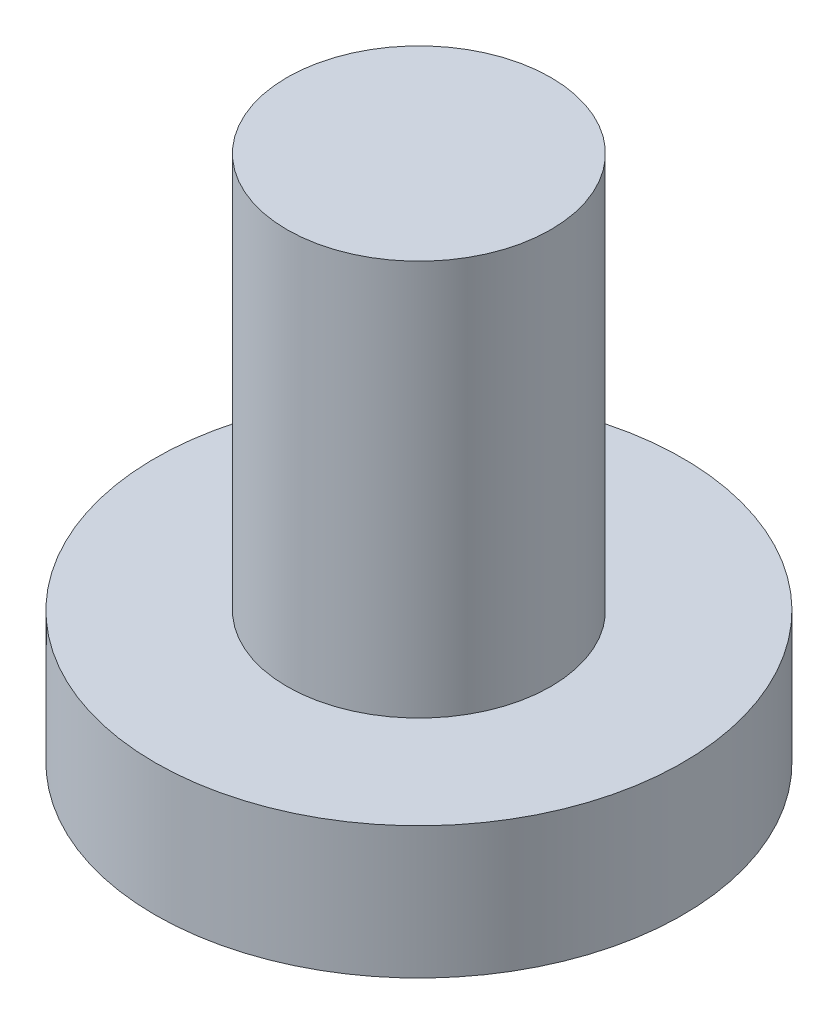
ISO-10303-21;
HEADER;
FILE_DESCRIPTION(('STEP AP214'),'2;1');
FILE_NAME('part.step','',(''),(''),'','','');
FILE_SCHEMA(('AUTOMOTIVE_DESIGN { 1 0 10303 214 1 1 1 1 }'));
ENDSEC;
DATA;
#1=APPLICATION_CONTEXT('core data for automotive mechanical design processes');
#2=APPLICATION_PROTOCOL_DEFINITION('international standard','automotive_design',2000,#1);
#3=PRODUCT_CONTEXT('',#1,'mechanical');
#4=PRODUCT('Part','Part','',(#3));
#5=PRODUCT_RELATED_PRODUCT_CATEGORY('part','',(#4));
#6=PRODUCT_DEFINITION_FORMATION('','',#4);
#7=PRODUCT_DEFINITION_CONTEXT('part definition',#1,'design');
#8=PRODUCT_DEFINITION('design','',#6,#7);
#9=PRODUCT_DEFINITION_SHAPE('','',#8);
#10=(LENGTH_UNIT() NAMED_UNIT(*) SI_UNIT(.MILLI.,.METRE.));
#11=(NAMED_UNIT(*) PLANE_ANGLE_UNIT() SI_UNIT($,.RADIAN.));
#12=(NAMED_UNIT(*) SI_UNIT($,.STERADIAN.) SOLID_ANGLE_UNIT());
#13=UNCERTAINTY_MEASURE_WITH_UNIT(LENGTH_MEASURE(1.E-05),#10,'distance_accuracy_value','');
#14=(GEOMETRIC_REPRESENTATION_CONTEXT(3) GLOBAL_UNCERTAINTY_ASSIGNED_CONTEXT((#13)) GLOBAL_UNIT_ASSIGNED_CONTEXT((#10,
#11,#12)) REPRESENTATION_CONTEXT('',''));
#15=CARTESIAN_POINT('',(0.,0.,0.));
#16=DIRECTION('',(0.,0.,1.));
#17=DIRECTION('',(1.,0.,0.));
#18=AXIS2_PLACEMENT_3D('',#15,#16,#17);
#19=CARTESIAN_POINT('',(0.,2.,0.));
#20=DIRECTION('',(0.,-1.,0.));
#21=DIRECTION('',(0.,0.,-1.));
#22=AXIS2_PLACEMENT_3D('',#19,#20,#21);
#23=CYLINDRICAL_SURFACE('',#22,4.);
#24=CARTESIAN_POINT('',(0.,2.,0.));
#25=DIRECTION('',(0.,1.,0.));
#26=DIRECTION('',(0.,0.,1.));
#27=AXIS2_PLACEMENT_3D('',#24,#25,#26);
#28=CIRCLE('',#27,4.);
#29=CARTESIAN_POINT('',(0.,2.,4.));
#30=VERTEX_POINT('',#29);
#31=EDGE_CURVE('E39',#30,#30,#28,.T.);
#32=ORIENTED_EDGE('',*,*,#31,.F.);
#33=EDGE_LOOP('',(#32));
#34=FACE_BOUND('',#33,.T.);
#35=CARTESIAN_POINT('',(0.,0.,0.));
#36=DIRECTION('',(0.,1.,0.));
#37=DIRECTION('',(0.,0.,1.));
#38=AXIS2_PLACEMENT_3D('',#35,#36,#37);
#39=CIRCLE('',#38,4.);
#40=CARTESIAN_POINT('',(0.,0.,4.));
#41=VERTEX_POINT('',#40);
#42=EDGE_CURVE('E35',#41,#41,#39,.T.);
#43=ORIENTED_EDGE('',*,*,#42,.T.);
#44=EDGE_LOOP('',(#43));
#45=FACE_BOUND('',#44,.T.);
#46=ADVANCED_FACE('F32',(#34,#45),#23,.T.);
#47=CARTESIAN_POINT('',(0.,2.,0.));
#48=DIRECTION('',(0.,1.,0.));
#49=DIRECTION('',(0.,0.,1.));
#50=AXIS2_PLACEMENT_3D('',#47,#48,#49);
#51=PLANE('',#50);
#52=CARTESIAN_POINT('',(0.,2.,0.));
#53=DIRECTION('',(0.,1.,0.));
#54=DIRECTION('',(0.,0.,1.));
#55=AXIS2_PLACEMENT_3D('',#52,#53,#54);
#56=CIRCLE('',#55,2.);
#57=CARTESIAN_POINT('',(0.,2.,2.));
#58=VERTEX_POINT('',#57);
#59=EDGE_CURVE('E10',#58,#58,#56,.T.);
#60=ORIENTED_EDGE('',*,*,#59,.F.);
#61=EDGE_LOOP('',(#60));
#62=FACE_BOUND('',#61,.T.);
#63=ORIENTED_EDGE('',*,*,#31,.T.);
#64=EDGE_LOOP('',(#63));
#65=FACE_BOUND('',#64,.T.);
#66=ADVANCED_FACE('F56',(#62,#65),#51,.T.);
#67=CARTESIAN_POINT('',(0.,0.,0.));
#68=DIRECTION('',(0.,1.,0.));
#69=DIRECTION('',(0.,0.,1.));
#70=AXIS2_PLACEMENT_3D('',#67,#68,#69);
#71=PLANE('',#70);
#72=ORIENTED_EDGE('',*,*,#42,.F.);
#73=EDGE_LOOP('',(#72));
#74=FACE_BOUND('',#73,.T.);
#75=ADVANCED_FACE('F53',(#74),#71,.F.);
#76=CARTESIAN_POINT('',(0.,8.,0.));
#77=DIRECTION('',(0.,-1.,0.));
#78=DIRECTION('',(0.,0.,-1.));
#79=AXIS2_PLACEMENT_3D('',#76,#77,#78);
#80=CYLINDRICAL_SURFACE('',#79,2.);
#81=CARTESIAN_POINT('',(0.,8.,0.));
#82=DIRECTION('',(0.,1.,0.));
#83=DIRECTION('',(0.,0.,1.));
#84=AXIS2_PLACEMENT_3D('',#81,#82,#83);
#85=CIRCLE('',#84,2.);
#86=CARTESIAN_POINT('',(0.,8.,2.));
#87=VERTEX_POINT('',#86);
#88=EDGE_CURVE('E45',#87,#87,#85,.T.);
#89=ORIENTED_EDGE('',*,*,#88,.F.);
#90=EDGE_LOOP('',(#89));
#91=FACE_BOUND('',#90,.T.);
#92=ORIENTED_EDGE('',*,*,#59,.T.);
#93=EDGE_LOOP('',(#92));
#94=FACE_BOUND('',#93,.T.);
#95=ADVANCED_FACE('F55',(#91,#94),#80,.T.);
#96=CARTESIAN_POINT('',(0.,8.,0.));
#97=DIRECTION('',(0.,1.,0.));
#98=DIRECTION('',(0.,0.,1.));
#99=AXIS2_PLACEMENT_3D('',#96,#97,#98);
#100=PLANE('',#99);
#101=ORIENTED_EDGE('',*,*,#88,.T.);
#102=EDGE_LOOP('',(#101));
#103=FACE_BOUND('',#102,.T.);
#104=ADVANCED_FACE('F61',(#103),#100,.T.);
#105=CLOSED_SHELL('',(#46,#66,#75,#95,#104));
#106=MANIFOLD_SOLID_BREP('B2',#105);
#107=ADVANCED_BREP_SHAPE_REPRESENTATION('',(#18,#106),#14);
#108=SHAPE_DEFINITION_REPRESENTATION(#9,#107);
ENDSEC;
END-ISO-10303-21;
